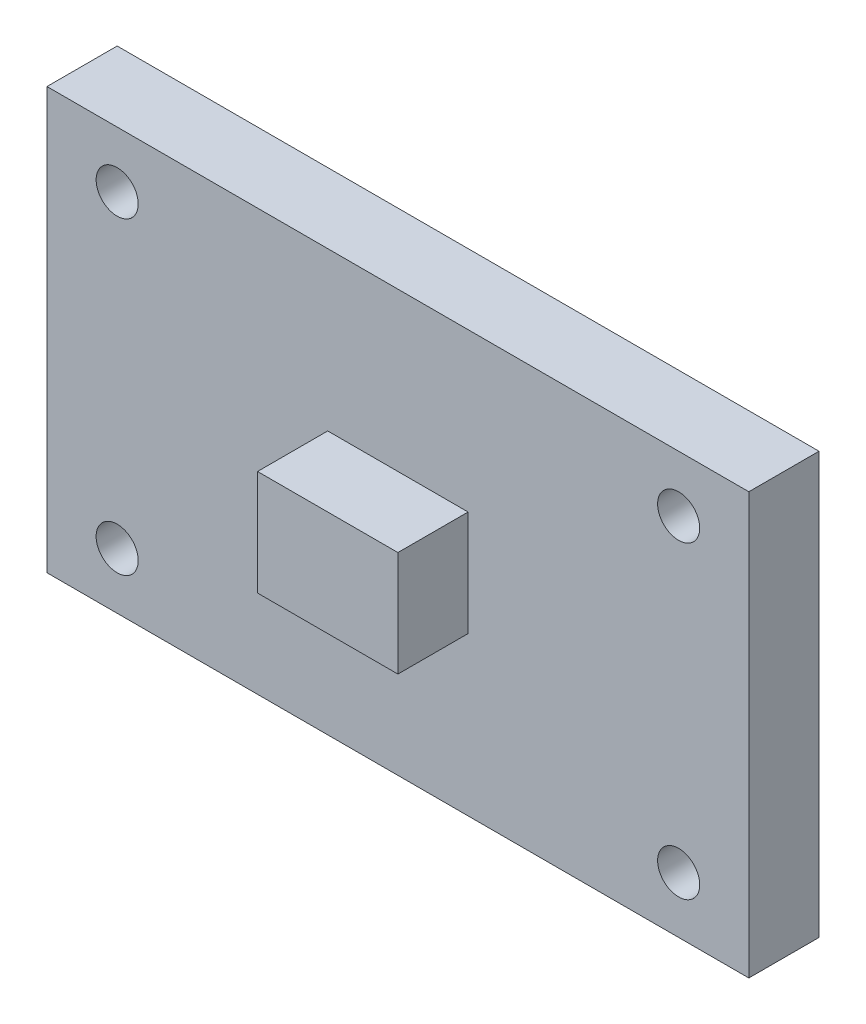
ISO-10303-21;
HEADER;
FILE_DESCRIPTION(('STEP AP214'),'2;1');
FILE_NAME('part.step','',(''),(''),'','','');
FILE_SCHEMA(('AUTOMOTIVE_DESIGN { 1 0 10303 214 1 1 1 1 }'));
ENDSEC;
DATA;
#1=APPLICATION_CONTEXT('core data for automotive mechanical design processes');
#2=APPLICATION_PROTOCOL_DEFINITION('international standard','automotive_design',2000,#1);
#3=PRODUCT_CONTEXT('',#1,'mechanical');
#4=PRODUCT('Part','Part','',(#3));
#5=PRODUCT_RELATED_PRODUCT_CATEGORY('part','',(#4));
#6=PRODUCT_DEFINITION_FORMATION('','',#4);
#7=PRODUCT_DEFINITION_CONTEXT('part definition',#1,'design');
#8=PRODUCT_DEFINITION('design','',#6,#7);
#9=PRODUCT_DEFINITION_SHAPE('','',#8);
#10=(LENGTH_UNIT() NAMED_UNIT(*) SI_UNIT(.MILLI.,.METRE.));
#11=(NAMED_UNIT(*) PLANE_ANGLE_UNIT() SI_UNIT($,.RADIAN.));
#12=(NAMED_UNIT(*) SI_UNIT($,.STERADIAN.) SOLID_ANGLE_UNIT());
#13=UNCERTAINTY_MEASURE_WITH_UNIT(LENGTH_MEASURE(1.E-05),#10,'distance_accuracy_value','');
#14=(GEOMETRIC_REPRESENTATION_CONTEXT(3) GLOBAL_UNCERTAINTY_ASSIGNED_CONTEXT((#13)) GLOBAL_UNIT_ASSIGNED_CONTEXT((#10,
#11,#12)) REPRESENTATION_CONTEXT('',''));
#15=CARTESIAN_POINT('',(0.,0.,0.));
#16=DIRECTION('',(0.,0.,1.));
#17=DIRECTION('',(1.,0.,0.));
#18=AXIS2_PLACEMENT_3D('',#15,#16,#17);
#19=CARTESIAN_POINT('',(0.,0.,20.));
#20=DIRECTION('',(0.,0.,1.));
#21=DIRECTION('',(1.,0.,0.));
#22=AXIS2_PLACEMENT_3D('',#19,#20,#21);
#23=PLANE('',#22);
#24=DIRECTION('',(1.,0.,0.));
#25=VECTOR('',#24,1.);
#26=CARTESIAN_POINT('',(-10.,-7.5,20.));
#27=LINE('',#26,#25);
#28=CARTESIAN_POINT('',(-10.,-7.5,20.));
#29=VERTEX_POINT('',#28);
#30=CARTESIAN_POINT('',(10.,-7.5,20.));
#31=VERTEX_POINT('',#30);
#32=EDGE_CURVE('E10',#29,#31,#27,.T.);
#33=ORIENTED_EDGE('',*,*,#32,.T.);
#34=DIRECTION('',(0.,1.,0.));
#35=VECTOR('',#34,1.);
#36=CARTESIAN_POINT('',(10.,-7.5,20.));
#37=LINE('',#36,#35);
#38=CARTESIAN_POINT('',(10.,7.5,20.));
#39=VERTEX_POINT('',#38);
#40=EDGE_CURVE('E210',#31,#39,#37,.T.);
#41=ORIENTED_EDGE('',*,*,#40,.T.);
#42=DIRECTION('',(-1.,0.,0.));
#43=VECTOR('',#42,1.);
#44=CARTESIAN_POINT('',(10.,7.5,20.));
#45=LINE('',#44,#43);
#46=CARTESIAN_POINT('',(-10.,7.5,20.));
#47=VERTEX_POINT('',#46);
#48=EDGE_CURVE('E268',#39,#47,#45,.T.);
#49=ORIENTED_EDGE('',*,*,#48,.T.);
#50=DIRECTION('',(0.,-1.,0.));
#51=VECTOR('',#50,1.);
#52=CARTESIAN_POINT('',(-10.,7.5,20.));
#53=LINE('',#52,#51);
#54=EDGE_CURVE('E24',#47,#29,#53,.T.);
#55=ORIENTED_EDGE('',*,*,#54,.T.);
#56=EDGE_LOOP('',(#33,#41,#49,#55));
#57=FACE_BOUND('',#56,.T.);
#58=ADVANCED_FACE('F16',(#57),#23,.T.);
#59=CARTESIAN_POINT('',(0.,-2.,-5.));
#60=DIRECTION('',(0.,0.,1.));
#61=DIRECTION('',(1.,0.,0.));
#62=AXIS2_PLACEMENT_3D('',#59,#60,#61);
#63=PLANE('',#62);
#64=DIRECTION('',(0.,1.,0.));
#65=VECTOR('',#64,1.);
#66=CARTESIAN_POINT('',(0.,-2.,-5.));
#67=LINE('',#66,#65);
#68=CARTESIAN_POINT('',(0.,-2.,-5.));
#69=VERTEX_POINT('',#68);
#70=CARTESIAN_POINT('',(0.,2.,-5.));
#71=VERTEX_POINT('',#70);
#72=EDGE_CURVE('E279',#69,#71,#67,.T.);
#73=ORIENTED_EDGE('',*,*,#72,.T.);
#74=DIRECTION('',(1.,0.,0.));
#75=VECTOR('',#74,1.);
#76=CARTESIAN_POINT('',(0.,2.,-5.));
#77=LINE('',#76,#75);
#78=CARTESIAN_POINT('',(25.,2.,-5.));
#79=VERTEX_POINT('',#78);
#80=EDGE_CURVE('E250',#71,#79,#77,.T.);
#81=ORIENTED_EDGE('',*,*,#80,.T.);
#82=DIRECTION('',(0.,1.,0.));
#83=VECTOR('',#82,1.);
#84=CARTESIAN_POINT('',(25.,-2.,-5.));
#85=LINE('',#84,#83);
#86=CARTESIAN_POINT('',(25.,-2.,-5.));
#87=VERTEX_POINT('',#86);
#88=EDGE_CURVE('E175',#87,#79,#85,.T.);
#89=ORIENTED_EDGE('',*,*,#88,.F.);
#90=DIRECTION('',(1.,0.,0.));
#91=VECTOR('',#90,1.);
#92=CARTESIAN_POINT('',(0.,-2.,-5.));
#93=LINE('',#92,#91);
#94=EDGE_CURVE('E171',#69,#87,#93,.T.);
#95=ORIENTED_EDGE('',*,*,#94,.F.);
#96=EDGE_LOOP('',(#73,#81,#89,#95));
#97=FACE_BOUND('',#96,.T.);
#98=ADVANCED_FACE('F409',(#97),#63,.F.);
#99=CARTESIAN_POINT('',(-10.,-7.5,0.));
#100=DIRECTION('',(0.,1.,0.));
#101=DIRECTION('',(1.,0.,0.));
#102=AXIS2_PLACEMENT_3D('',#99,#100,#101);
#103=PLANE('',#102);
#104=DIRECTION('',(0.,0.,1.));
#105=VECTOR('',#104,1.);
#106=CARTESIAN_POINT('',(10.,-7.5,0.));
#107=LINE('',#106,#105);
#108=CARTESIAN_POINT('',(10.,-7.5,10.));
#109=VERTEX_POINT('',#108);
#110=EDGE_CURVE('E295',#109,#31,#107,.T.);
#111=ORIENTED_EDGE('',*,*,#110,.T.);
#112=ORIENTED_EDGE('',*,*,#32,.F.);
#113=DIRECTION('',(0.,0.,1.));
#114=VECTOR('',#113,1.);
#115=CARTESIAN_POINT('',(-10.,-7.5,0.));
#116=LINE('',#115,#114);
#117=CARTESIAN_POINT('',(-10.,-7.5,10.));
#118=VERTEX_POINT('',#117);
#119=EDGE_CURVE('E265',#118,#29,#116,.T.);
#120=ORIENTED_EDGE('',*,*,#119,.F.);
#121=DIRECTION('',(-1.,0.,0.));
#122=VECTOR('',#121,1.);
#123=CARTESIAN_POINT('',(-5.,-7.5,10.));
#124=LINE('',#123,#122);
#125=EDGE_CURVE('E260',#109,#118,#124,.T.);
#126=ORIENTED_EDGE('',*,*,#125,.F.);
#127=EDGE_LOOP('',(#111,#112,#120,#126));
#128=FACE_BOUND('',#127,.T.);
#129=ADVANCED_FACE('F309',(#128),#103,.F.);
#130=CARTESIAN_POINT('',(-10.,7.5,0.));
#131=DIRECTION('',(1.,0.,0.));
#132=DIRECTION('',(0.,1.,0.));
#133=AXIS2_PLACEMENT_3D('',#130,#131,#132);
#134=PLANE('',#133);
#135=ORIENTED_EDGE('',*,*,#119,.T.);
#136=ORIENTED_EDGE('',*,*,#54,.F.);
#137=DIRECTION('',(0.,0.,1.));
#138=VECTOR('',#137,1.);
#139=CARTESIAN_POINT('',(-10.,7.5,0.));
#140=LINE('',#139,#138);
#141=CARTESIAN_POINT('',(-10.,7.5,10.));
#142=VERTEX_POINT('',#141);
#143=EDGE_CURVE('E298',#142,#47,#140,.T.);
#144=ORIENTED_EDGE('',*,*,#143,.F.);
#145=DIRECTION('',(0.,1.,0.));
#146=VECTOR('',#145,1.);
#147=CARTESIAN_POINT('',(-10.,3.75,10.));
#148=LINE('',#147,#146);
#149=EDGE_CURVE('E264',#118,#142,#148,.T.);
#150=ORIENTED_EDGE('',*,*,#149,.F.);
#151=EDGE_LOOP('',(#135,#136,#144,#150));
#152=FACE_BOUND('',#151,.T.);
#153=ADVANCED_FACE('F307',(#152),#134,.F.);
#154=CARTESIAN_POINT('',(10.,7.5,0.));
#155=DIRECTION('',(0.,-1.,0.));
#156=DIRECTION('',(0.,0.,-1.));
#157=AXIS2_PLACEMENT_3D('',#154,#155,#156);
#158=PLANE('',#157);
#159=ORIENTED_EDGE('',*,*,#143,.T.);
#160=ORIENTED_EDGE('',*,*,#48,.F.);
#161=DIRECTION('',(0.,0.,1.));
#162=VECTOR('',#161,1.);
#163=CARTESIAN_POINT('',(10.,7.5,0.));
#164=LINE('',#163,#162);
#165=CARTESIAN_POINT('',(10.,7.5,10.));
#166=VERTEX_POINT('',#165);
#167=EDGE_CURVE('E207',#166,#39,#164,.T.);
#168=ORIENTED_EDGE('',*,*,#167,.F.);
#169=DIRECTION('',(1.,0.,0.));
#170=VECTOR('',#169,1.);
#171=CARTESIAN_POINT('',(5.,7.5,10.));
#172=LINE('',#171,#170);
#173=EDGE_CURVE('E217',#142,#166,#172,.T.);
#174=ORIENTED_EDGE('',*,*,#173,.F.);
#175=EDGE_LOOP('',(#159,#160,#168,#174));
#176=FACE_BOUND('',#175,.T.);
#177=ADVANCED_FACE('F320',(#176),#158,.F.);
#178=CARTESIAN_POINT('',(10.,-7.5,0.));
#179=DIRECTION('',(-1.,0.,0.));
#180=DIRECTION('',(0.,0.,1.));
#181=AXIS2_PLACEMENT_3D('',#178,#179,#180);
#182=PLANE('',#181);
#183=ORIENTED_EDGE('',*,*,#167,.T.);
#184=ORIENTED_EDGE('',*,*,#40,.F.);
#185=ORIENTED_EDGE('',*,*,#110,.F.);
#186=DIRECTION('',(0.,-1.,0.));
#187=VECTOR('',#186,1.);
#188=CARTESIAN_POINT('',(10.,-3.75,10.));
#189=LINE('',#188,#187);
#190=EDGE_CURVE('E256',#166,#109,#189,.T.);
#191=ORIENTED_EDGE('',*,*,#190,.F.);
#192=EDGE_LOOP('',(#183,#184,#185,#191));
#193=FACE_BOUND('',#192,.T.);
#194=ADVANCED_FACE('F318',(#193),#182,.F.);
#195=CARTESIAN_POINT('',(40.,22.,0.));
#196=DIRECTION('',(0.,0.,-1.));
#197=DIRECTION('',(1.,0.,0.));
#198=AXIS2_PLACEMENT_3D('',#195,#196,#197);
#199=CYLINDRICAL_SURFACE('',#198,3.);
#200=CARTESIAN_POINT('',(40.,22.,0.));
#201=DIRECTION('',(0.,0.,1.));
#202=DIRECTION('',(1.,0.,0.));
#203=AXIS2_PLACEMENT_3D('',#200,#201,#202);
#204=CIRCLE('',#203,3.);
#205=CARTESIAN_POINT('',(43.,22.,0.));
#206=VERTEX_POINT('',#205);
#207=EDGE_CURVE('E234',#206,#206,#204,.T.);
#208=ORIENTED_EDGE('',*,*,#207,.F.);
#209=DIRECTION('',(0.,0.,1.));
#210=VECTOR('',#209,1.);
#211=CARTESIAN_POINT('',(43.,22.,0.));
#212=LINE('',#211,#210);
#213=CARTESIAN_POINT('',(43.,22.,10.));
#214=VERTEX_POINT('',#213);
#215=EDGE_CURVE('E211',#206,#214,#212,.T.);
#216=ORIENTED_EDGE('',*,*,#215,.T.);
#217=CARTESIAN_POINT('',(40.,22.,10.));
#218=DIRECTION('',(0.,0.,-1.));
#219=DIRECTION('',(1.,0.,0.));
#220=AXIS2_PLACEMENT_3D('',#217,#218,#219);
#221=CIRCLE('',#220,3.);
#222=EDGE_CURVE('E212',#214,#214,#221,.T.);
#223=ORIENTED_EDGE('',*,*,#222,.F.);
#224=ORIENTED_EDGE('',*,*,#215,.F.);
#225=EDGE_LOOP('',(#208,#216,#223,#224));
#226=FACE_BOUND('',#225,.T.);
#227=ADVANCED_FACE('F524',(#226),#199,.F.);
#228=CARTESIAN_POINT('',(0.,2.,-5.));
#229=DIRECTION('',(0.,-1.,0.));
#230=DIRECTION('',(0.,0.,-1.));
#231=AXIS2_PLACEMENT_3D('',#228,#229,#230);
#232=PLANE('',#231);
#233=DIRECTION('',(1.,0.,0.));
#234=VECTOR('',#233,1.);
#235=CARTESIAN_POINT('',(0.,2.,0.));
#236=LINE('',#235,#234);
#237=CARTESIAN_POINT('',(0.,2.,0.));
#238=VERTEX_POINT('',#237);
#239=CARTESIAN_POINT('',(25.,2.,0.));
#240=VERTEX_POINT('',#239);
#241=EDGE_CURVE('E186',#238,#240,#236,.T.);
#242=ORIENTED_EDGE('',*,*,#241,.T.);
#243=DIRECTION('',(0.,0.,1.));
#244=VECTOR('',#243,1.);
#245=CARTESIAN_POINT('',(25.,2.,-5.));
#246=LINE('',#245,#244);
#247=EDGE_CURVE('E181',#79,#240,#246,.T.);
#248=ORIENTED_EDGE('',*,*,#247,.F.);
#249=ORIENTED_EDGE('',*,*,#80,.F.);
#250=DIRECTION('',(0.,0.,1.));
#251=VECTOR('',#250,1.);
#252=CARTESIAN_POINT('',(0.,2.,-5.));
#253=LINE('',#252,#251);
#254=EDGE_CURVE('E276',#71,#238,#253,.T.);
#255=ORIENTED_EDGE('',*,*,#254,.T.);
#256=EDGE_LOOP('',(#242,#248,#249,#255));
#257=FACE_BOUND('',#256,.T.);
#258=ADVANCED_FACE('F515',(#257),#232,.F.);
#259=CARTESIAN_POINT('',(25.,0.,0.));
#260=DIRECTION('',(1.,0.,0.));
#261=DIRECTION('',(0.,1.,0.));
#262=AXIS2_PLACEMENT_3D('',#259,#260,#261);
#263=PLANE('',#262);
#264=DIRECTION('',(0.,0.,-1.));
#265=VECTOR('',#264,1.);
#266=CARTESIAN_POINT('',(25.,-2.,5.));
#267=LINE('',#266,#265);
#268=CARTESIAN_POINT('',(25.,-2.,0.));
#269=VERTEX_POINT('',#268);
#270=EDGE_CURVE('E165',#269,#87,#267,.T.);
#271=ORIENTED_EDGE('',*,*,#270,.T.);
#272=ORIENTED_EDGE('',*,*,#88,.T.);
#273=ORIENTED_EDGE('',*,*,#247,.T.);
#274=DIRECTION('',(0.,1.,0.));
#275=VECTOR('',#274,1.);
#276=CARTESIAN_POINT('',(25.,0.,0.));
#277=LINE('',#276,#275);
#278=EDGE_CURVE('E178',#269,#240,#277,.T.);
#279=ORIENTED_EDGE('',*,*,#278,.F.);
#280=EDGE_LOOP('',(#271,#272,#273,#279));
#281=FACE_BOUND('',#280,.T.);
#282=ADVANCED_FACE('F179',(#281),#263,.T.);
#283=CARTESIAN_POINT('',(0.,-2.,5.));
#284=DIRECTION('',(0.,1.,0.));
#285=DIRECTION('',(1.,0.,0.));
#286=AXIS2_PLACEMENT_3D('',#283,#284,#285);
#287=PLANE('',#286);
#288=ORIENTED_EDGE('',*,*,#94,.T.);
#289=ORIENTED_EDGE('',*,*,#270,.F.);
#290=DIRECTION('',(-1.,0.,0.));
#291=VECTOR('',#290,1.);
#292=CARTESIAN_POINT('',(0.,-2.,0.));
#293=LINE('',#292,#291);
#294=CARTESIAN_POINT('',(0.,-2.,0.));
#295=VERTEX_POINT('',#294);
#296=EDGE_CURVE('E170',#269,#295,#293,.T.);
#297=ORIENTED_EDGE('',*,*,#296,.T.);
#298=DIRECTION('',(0.,0.,-1.));
#299=VECTOR('',#298,1.);
#300=CARTESIAN_POINT('',(0.,-2.,5.));
#301=LINE('',#300,#299);
#302=EDGE_CURVE('E282',#295,#69,#301,.T.);
#303=ORIENTED_EDGE('',*,*,#302,.T.);
#304=EDGE_LOOP('',(#288,#289,#297,#303));
#305=FACE_BOUND('',#304,.T.);
#306=ADVANCED_FACE('F167',(#305),#287,.F.);
#307=CARTESIAN_POINT('',(0.,0.,0.));
#308=DIRECTION('',(1.,0.,0.));
#309=DIRECTION('',(0.,1.,0.));
#310=AXIS2_PLACEMENT_3D('',#307,#308,#309);
#311=PLANE('',#310);
#312=DIRECTION('',(0.,1.,0.));
#313=VECTOR('',#312,1.);
#314=CARTESIAN_POINT('',(0.,0.,0.));
#315=LINE('',#314,#313);
#316=EDGE_CURVE('E192',#295,#238,#315,.T.);
#317=ORIENTED_EDGE('',*,*,#316,.T.);
#318=ORIENTED_EDGE('',*,*,#254,.F.);
#319=ORIENTED_EDGE('',*,*,#72,.F.);
#320=ORIENTED_EDGE('',*,*,#302,.F.);
#321=EDGE_LOOP('',(#317,#318,#319,#320));
#322=FACE_BOUND('',#321,.T.);
#323=ADVANCED_FACE('F423',(#322),#311,.F.);
#324=CARTESIAN_POINT('',(-40.,22.,0.));
#325=DIRECTION('',(0.,0.,-1.));
#326=DIRECTION('',(1.,0.,0.));
#327=AXIS2_PLACEMENT_3D('',#324,#325,#326);
#328=CYLINDRICAL_SURFACE('',#327,3.);
#329=CARTESIAN_POINT('',(-40.,22.,0.));
#330=DIRECTION('',(0.,0.,1.));
#331=DIRECTION('',(1.,0.,0.));
#332=AXIS2_PLACEMENT_3D('',#329,#330,#331);
#333=CIRCLE('',#332,3.);
#334=CARTESIAN_POINT('',(-37.,22.,0.));
#335=VERTEX_POINT('',#334);
#336=EDGE_CURVE('E194',#335,#335,#333,.T.);
#337=ORIENTED_EDGE('',*,*,#336,.F.);
#338=DIRECTION('',(0.,0.,1.));
#339=VECTOR('',#338,1.);
#340=CARTESIAN_POINT('',(-37.,22.,0.));
#341=LINE('',#340,#339);
#342=CARTESIAN_POINT('',(-37.,22.,10.));
#343=VERTEX_POINT('',#342);
#344=EDGE_CURVE('E231',#335,#343,#341,.T.);
#345=ORIENTED_EDGE('',*,*,#344,.T.);
#346=CARTESIAN_POINT('',(-40.,22.,10.));
#347=DIRECTION('',(0.,0.,-1.));
#348=DIRECTION('',(1.,0.,0.));
#349=AXIS2_PLACEMENT_3D('',#346,#347,#348);
#350=CIRCLE('',#349,3.);
#351=EDGE_CURVE('E249',#343,#343,#350,.T.);
#352=ORIENTED_EDGE('',*,*,#351,.F.);
#353=ORIENTED_EDGE('',*,*,#344,.F.);
#354=EDGE_LOOP('',(#337,#345,#352,#353));
#355=FACE_BOUND('',#354,.T.);
#356=ADVANCED_FACE('F482',(#355),#328,.F.);
#357=CARTESIAN_POINT('',(40.,-22.,0.));
#358=DIRECTION('',(0.,0.,-1.));
#359=DIRECTION('',(1.,0.,0.));
#360=AXIS2_PLACEMENT_3D('',#357,#358,#359);
#361=CYLINDRICAL_SURFACE('',#360,3.);
#362=CARTESIAN_POINT('',(40.,-22.,0.));
#363=DIRECTION('',(0.,0.,1.));
#364=DIRECTION('',(1.,0.,0.));
#365=AXIS2_PLACEMENT_3D('',#362,#363,#364);
#366=CIRCLE('',#365,3.);
#367=CARTESIAN_POINT('',(43.,-22.,0.));
#368=VERTEX_POINT('',#367);
#369=EDGE_CURVE('E201',#368,#368,#366,.T.);
#370=ORIENTED_EDGE('',*,*,#369,.F.);
#371=DIRECTION('',(0.,0.,1.));
#372=VECTOR('',#371,1.);
#373=CARTESIAN_POINT('',(43.,-22.,0.));
#374=LINE('',#373,#372);
#375=CARTESIAN_POINT('',(43.,-22.,10.));
#376=VERTEX_POINT('',#375);
#377=EDGE_CURVE('E228',#368,#376,#374,.T.);
#378=ORIENTED_EDGE('',*,*,#377,.T.);
#379=CARTESIAN_POINT('',(40.,-22.,10.));
#380=DIRECTION('',(0.,0.,-1.));
#381=DIRECTION('',(1.,0.,0.));
#382=AXIS2_PLACEMENT_3D('',#379,#380,#381);
#383=CIRCLE('',#382,3.);
#384=EDGE_CURVE('E239',#376,#376,#383,.T.);
#385=ORIENTED_EDGE('',*,*,#384,.F.);
#386=ORIENTED_EDGE('',*,*,#377,.F.);
#387=EDGE_LOOP('',(#370,#378,#385,#386));
#388=FACE_BOUND('',#387,.T.);
#389=ADVANCED_FACE('F356',(#388),#361,.F.);
#390=CARTESIAN_POINT('',(-40.,-22.,0.));
#391=DIRECTION('',(0.,0.,-1.));
#392=DIRECTION('',(1.,0.,0.));
#393=AXIS2_PLACEMENT_3D('',#390,#391,#392);
#394=CYLINDRICAL_SURFACE('',#393,3.);
#395=CARTESIAN_POINT('',(-40.,-22.,0.));
#396=DIRECTION('',(0.,0.,1.));
#397=DIRECTION('',(1.,0.,0.));
#398=AXIS2_PLACEMENT_3D('',#395,#396,#397);
#399=CIRCLE('',#398,3.);
#400=CARTESIAN_POINT('',(-37.,-22.,0.));
#401=VERTEX_POINT('',#400);
#402=EDGE_CURVE('E221',#401,#401,#399,.T.);
#403=ORIENTED_EDGE('',*,*,#402,.F.);
#404=DIRECTION('',(0.,0.,1.));
#405=VECTOR('',#404,1.);
#406=CARTESIAN_POINT('',(-37.,-22.,0.));
#407=LINE('',#406,#405);
#408=CARTESIAN_POINT('',(-37.,-22.,10.));
#409=VERTEX_POINT('',#408);
#410=EDGE_CURVE('E216',#401,#409,#407,.T.);
#411=ORIENTED_EDGE('',*,*,#410,.T.);
#412=CARTESIAN_POINT('',(-40.,-22.,10.));
#413=DIRECTION('',(0.,0.,-1.));
#414=DIRECTION('',(1.,0.,0.));
#415=AXIS2_PLACEMENT_3D('',#412,#413,#414);
#416=CIRCLE('',#415,3.);
#417=EDGE_CURVE('E235',#409,#409,#416,.T.);
#418=ORIENTED_EDGE('',*,*,#417,.F.);
#419=ORIENTED_EDGE('',*,*,#410,.F.);
#420=EDGE_LOOP('',(#403,#411,#418,#419));
#421=FACE_BOUND('',#420,.T.);
#422=ADVANCED_FACE('F399',(#421),#394,.F.);
#423=CARTESIAN_POINT('',(50.,30.,0.));
#424=DIRECTION('',(0.,-1.,0.));
#425=DIRECTION('',(0.,0.,-1.));
#426=AXIS2_PLACEMENT_3D('',#423,#424,#425);
#427=PLANE('',#426);
#428=DIRECTION('',(-1.,0.,0.));
#429=VECTOR('',#428,1.);
#430=CARTESIAN_POINT('',(50.,30.,0.));
#431=LINE('',#430,#429);
#432=CARTESIAN_POINT('',(50.,30.,0.));
#433=VERTEX_POINT('',#432);
#434=CARTESIAN_POINT('',(-50.,30.,0.));
#435=VERTEX_POINT('',#434);
#436=EDGE_CURVE('E218',#433,#435,#431,.T.);
#437=ORIENTED_EDGE('',*,*,#436,.T.);
#438=DIRECTION('',(0.,0.,1.));
#439=VECTOR('',#438,1.);
#440=CARTESIAN_POINT('',(-50.,30.,0.));
#441=LINE('',#440,#439);
#442=CARTESIAN_POINT('',(-50.,30.,10.));
#443=VERTEX_POINT('',#442);
#444=EDGE_CURVE('E339',#435,#443,#441,.T.);
#445=ORIENTED_EDGE('',*,*,#444,.T.);
#446=DIRECTION('',(-1.,0.,0.));
#447=VECTOR('',#446,1.);
#448=CARTESIAN_POINT('',(50.,30.,10.));
#449=LINE('',#448,#447);
#450=CARTESIAN_POINT('',(50.,30.,10.));
#451=VERTEX_POINT('',#450);
#452=EDGE_CURVE('E240',#451,#443,#449,.T.);
#453=ORIENTED_EDGE('',*,*,#452,.F.);
#454=DIRECTION('',(0.,0.,1.));
#455=VECTOR('',#454,1.);
#456=CARTESIAN_POINT('',(50.,30.,0.));
#457=LINE('',#456,#455);
#458=EDGE_CURVE('E205',#433,#451,#457,.T.);
#459=ORIENTED_EDGE('',*,*,#458,.F.);
#460=EDGE_LOOP('',(#437,#445,#453,#459));
#461=FACE_BOUND('',#460,.T.);
#462=ADVANCED_FACE('F361',(#461),#427,.F.);
#463=CARTESIAN_POINT('',(0.,0.,10.));
#464=DIRECTION('',(0.,0.,1.));
#465=DIRECTION('',(1.,0.,0.));
#466=AXIS2_PLACEMENT_3D('',#463,#464,#465);
#467=PLANE('',#466);
#468=ORIENTED_EDGE('',*,*,#222,.T.);
#469=EDGE_LOOP('',(#468));
#470=FACE_BOUND('',#469,.T.);
#471=ORIENTED_EDGE('',*,*,#190,.T.);
#472=ORIENTED_EDGE('',*,*,#125,.T.);
#473=ORIENTED_EDGE('',*,*,#149,.T.);
#474=ORIENTED_EDGE('',*,*,#173,.T.);
#475=EDGE_LOOP('',(#471,#472,#473,#474));
#476=FACE_BOUND('',#475,.T.);
#477=ORIENTED_EDGE('',*,*,#351,.T.);
#478=EDGE_LOOP('',(#477));
#479=FACE_BOUND('',#478,.T.);
#480=ORIENTED_EDGE('',*,*,#384,.T.);
#481=EDGE_LOOP('',(#480));
#482=FACE_BOUND('',#481,.T.);
#483=ORIENTED_EDGE('',*,*,#417,.T.);
#484=EDGE_LOOP('',(#483));
#485=FACE_BOUND('',#484,.T.);
#486=DIRECTION('',(1.,0.,0.));
#487=VECTOR('',#486,1.);
#488=CARTESIAN_POINT('',(-50.,-30.,10.));
#489=LINE('',#488,#487);
#490=CARTESIAN_POINT('',(-50.,-30.,10.));
#491=VERTEX_POINT('',#490);
#492=CARTESIAN_POINT('',(50.,-30.,10.));
#493=VERTEX_POINT('',#492);
#494=EDGE_CURVE('E328',#491,#493,#489,.T.);
#495=ORIENTED_EDGE('',*,*,#494,.T.);
#496=DIRECTION('',(0.,1.,0.));
#497=VECTOR('',#496,1.);
#498=CARTESIAN_POINT('',(50.,-30.,10.));
#499=LINE('',#498,#497);
#500=EDGE_CURVE('E222',#493,#451,#499,.T.);
#501=ORIENTED_EDGE('',*,*,#500,.T.);
#502=ORIENTED_EDGE('',*,*,#452,.T.);
#503=DIRECTION('',(0.,-1.,0.));
#504=VECTOR('',#503,1.);
#505=CARTESIAN_POINT('',(-50.,30.,10.));
#506=LINE('',#505,#504);
#507=EDGE_CURVE('E336',#443,#491,#506,.T.);
#508=ORIENTED_EDGE('',*,*,#507,.T.);
#509=EDGE_LOOP('',(#495,#501,#502,#508));
#510=FACE_BOUND('',#509,.T.);
#511=ADVANCED_FACE('F314',(#470,#476,#479,#482,#485,#510),#467,.T.);
#512=CARTESIAN_POINT('',(0.,0.,0.));
#513=DIRECTION('',(0.,0.,1.));
#514=DIRECTION('',(1.,0.,0.));
#515=AXIS2_PLACEMENT_3D('',#512,#513,#514);
#516=PLANE('',#515);
#517=ORIENTED_EDGE('',*,*,#207,.T.);
#518=EDGE_LOOP('',(#517));
#519=FACE_BOUND('',#518,.T.);
#520=ORIENTED_EDGE('',*,*,#296,.F.);
#521=ORIENTED_EDGE('',*,*,#278,.T.);
#522=ORIENTED_EDGE('',*,*,#241,.F.);
#523=ORIENTED_EDGE('',*,*,#316,.F.);
#524=EDGE_LOOP('',(#520,#521,#522,#523));
#525=FACE_BOUND('',#524,.T.);
#526=ORIENTED_EDGE('',*,*,#336,.T.);
#527=EDGE_LOOP('',(#526));
#528=FACE_BOUND('',#527,.T.);
#529=ORIENTED_EDGE('',*,*,#369,.T.);
#530=EDGE_LOOP('',(#529));
#531=FACE_BOUND('',#530,.T.);
#532=ORIENTED_EDGE('',*,*,#402,.T.);
#533=EDGE_LOOP('',(#532));
#534=FACE_BOUND('',#533,.T.);
#535=DIRECTION('',(0.,-1.,0.));
#536=VECTOR('',#535,1.);
#537=CARTESIAN_POINT('',(-50.,30.,0.));
#538=LINE('',#537,#536);
#539=CARTESIAN_POINT('',(-50.,-30.,0.));
#540=VERTEX_POINT('',#539);
#541=EDGE_CURVE('E333',#435,#540,#538,.T.);
#542=ORIENTED_EDGE('',*,*,#541,.F.);
#543=ORIENTED_EDGE('',*,*,#436,.F.);
#544=DIRECTION('',(0.,1.,0.));
#545=VECTOR('',#544,1.);
#546=CARTESIAN_POINT('',(50.,-30.,0.));
#547=LINE('',#546,#545);
#548=CARTESIAN_POINT('',(50.,-30.,0.));
#549=VERTEX_POINT('',#548);
#550=EDGE_CURVE('E343',#549,#433,#547,.T.);
#551=ORIENTED_EDGE('',*,*,#550,.F.);
#552=DIRECTION('',(1.,0.,0.));
#553=VECTOR('',#552,1.);
#554=CARTESIAN_POINT('',(-50.,-30.,0.));
#555=LINE('',#554,#553);
#556=EDGE_CURVE('E378',#540,#549,#555,.T.);
#557=ORIENTED_EDGE('',*,*,#556,.F.);
#558=EDGE_LOOP('',(#542,#543,#551,#557));
#559=FACE_BOUND('',#558,.T.);
#560=ADVANCED_FACE('F189',(#519,#525,#528,#531,#534,#559),#516,.F.);
#561=CARTESIAN_POINT('',(50.,-30.,0.));
#562=DIRECTION('',(-1.,0.,0.));
#563=DIRECTION('',(0.,0.,1.));
#564=AXIS2_PLACEMENT_3D('',#561,#562,#563);
#565=PLANE('',#564);
#566=ORIENTED_EDGE('',*,*,#550,.T.);
#567=ORIENTED_EDGE('',*,*,#458,.T.);
#568=ORIENTED_EDGE('',*,*,#500,.F.);
#569=DIRECTION('',(0.,0.,1.));
#570=VECTOR('',#569,1.);
#571=CARTESIAN_POINT('',(50.,-30.,0.));
#572=LINE('',#571,#570);
#573=EDGE_CURVE('E373',#549,#493,#572,.T.);
#574=ORIENTED_EDGE('',*,*,#573,.F.);
#575=EDGE_LOOP('',(#566,#567,#568,#574));
#576=FACE_BOUND('',#575,.T.);
#577=ADVANCED_FACE('F393',(#576),#565,.F.);
#578=CARTESIAN_POINT('',(-50.,30.,0.));
#579=DIRECTION('',(1.,0.,0.));
#580=DIRECTION('',(0.,1.,0.));
#581=AXIS2_PLACEMENT_3D('',#578,#579,#580);
#582=PLANE('',#581);
#583=ORIENTED_EDGE('',*,*,#541,.T.);
#584=DIRECTION('',(0.,0.,1.));
#585=VECTOR('',#584,1.);
#586=CARTESIAN_POINT('',(-50.,-30.,0.));
#587=LINE('',#586,#585);
#588=EDGE_CURVE('E330',#540,#491,#587,.T.);
#589=ORIENTED_EDGE('',*,*,#588,.T.);
#590=ORIENTED_EDGE('',*,*,#507,.F.);
#591=ORIENTED_EDGE('',*,*,#444,.F.);
#592=EDGE_LOOP('',(#583,#589,#590,#591));
#593=FACE_BOUND('',#592,.T.);
#594=ADVANCED_FACE('F390',(#593),#582,.F.);
#595=CARTESIAN_POINT('',(-50.,-30.,0.));
#596=DIRECTION('',(0.,1.,0.));
#597=DIRECTION('',(1.,0.,0.));
#598=AXIS2_PLACEMENT_3D('',#595,#596,#597);
#599=PLANE('',#598);
#600=ORIENTED_EDGE('',*,*,#556,.T.);
#601=ORIENTED_EDGE('',*,*,#573,.T.);
#602=ORIENTED_EDGE('',*,*,#494,.F.);
#603=ORIENTED_EDGE('',*,*,#588,.F.);
#604=EDGE_LOOP('',(#600,#601,#602,#603));
#605=FACE_BOUND('',#604,.T.);
#606=ADVANCED_FACE('F376',(#605),#599,.F.);
#607=CLOSED_SHELL('',(#58,#98,#129,#153,#177,#194,#227,#258,#282,#306,#323,#356,#389,#422,#462,
#511,#560,#577,#594,#606));
#608=MANIFOLD_SOLID_BREP('B1',#607);
#609=ADVANCED_BREP_SHAPE_REPRESENTATION('',(#18,#608),#14);
#610=SHAPE_DEFINITION_REPRESENTATION(#9,#609);
ENDSEC;
END-ISO-10303-21;
